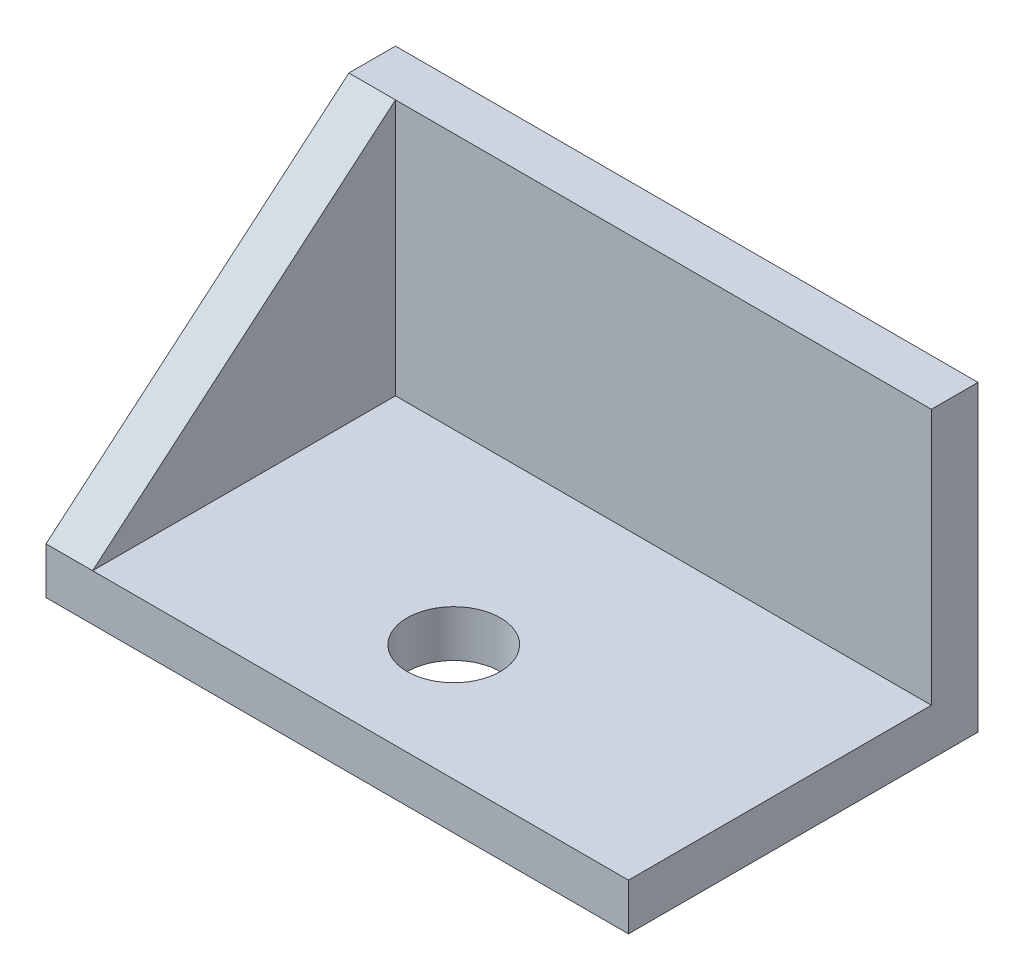
ISO-10303-21;
HEADER;
FILE_DESCRIPTION(('STEP AP214'),'2;1');
FILE_NAME('part.step','',(''),(''),'','','');
FILE_SCHEMA(('AUTOMOTIVE_DESIGN { 1 0 10303 214 1 1 1 1 }'));
ENDSEC;
DATA;
#1=APPLICATION_CONTEXT('core data for automotive mechanical design processes');
#2=APPLICATION_PROTOCOL_DEFINITION('international standard','automotive_design',2000,#1);
#3=PRODUCT_CONTEXT('',#1,'mechanical');
#4=PRODUCT('Part','Part','',(#3));
#5=PRODUCT_RELATED_PRODUCT_CATEGORY('part','',(#4));
#6=PRODUCT_DEFINITION_FORMATION('','',#4);
#7=PRODUCT_DEFINITION_CONTEXT('part definition',#1,'design');
#8=PRODUCT_DEFINITION('design','',#6,#7);
#9=PRODUCT_DEFINITION_SHAPE('','',#8);
#10=(LENGTH_UNIT() NAMED_UNIT(*) SI_UNIT(.MILLI.,.METRE.));
#11=(NAMED_UNIT(*) PLANE_ANGLE_UNIT() SI_UNIT($,.RADIAN.));
#12=(NAMED_UNIT(*) SI_UNIT($,.STERADIAN.) SOLID_ANGLE_UNIT());
#13=UNCERTAINTY_MEASURE_WITH_UNIT(LENGTH_MEASURE(1.E-05),#10,'distance_accuracy_value','');
#14=(GEOMETRIC_REPRESENTATION_CONTEXT(3) GLOBAL_UNCERTAINTY_ASSIGNED_CONTEXT((#13)) GLOBAL_UNIT_ASSIGNED_CONTEXT((#10,
#11,#12)) REPRESENTATION_CONTEXT('',''));
#15=CARTESIAN_POINT('',(0.,0.,0.));
#16=DIRECTION('',(0.,0.,1.));
#17=DIRECTION('',(1.,0.,0.));
#18=AXIS2_PLACEMENT_3D('',#15,#16,#17);
#19=CARTESIAN_POINT('',(0.,5.,0.));
#20=DIRECTION('',(0.,1.,0.));
#21=DIRECTION('',(0.,0.,1.));
#22=AXIS2_PLACEMENT_3D('',#19,#20,#21);
#23=PLANE('',#22);
#24=DIRECTION('',(0.,0.,-1.));
#25=VECTOR('',#24,1.);
#26=CARTESIAN_POINT('',(10.,5.,75.));
#27=LINE('',#26,#25);
#28=CARTESIAN_POINT('',(10.,5.,75.));
#29=VERTEX_POINT('',#28);
#30=CARTESIAN_POINT('',(10.,5.,10.));
#31=VERTEX_POINT('',#30);
#32=EDGE_CURVE('E58',#29,#31,#27,.T.);
#33=ORIENTED_EDGE('',*,*,#32,.F.);
#34=DIRECTION('',(1.,0.,0.));
#35=VECTOR('',#34,1.);
#36=CARTESIAN_POINT('',(0.,5.,75.));
#37=LINE('',#36,#35);
#38=CARTESIAN_POINT('',(125.,5.,75.));
#39=VERTEX_POINT('',#38);
#40=EDGE_CURVE('E150',#29,#39,#37,.T.);
#41=ORIENTED_EDGE('',*,*,#40,.T.);
#42=DIRECTION('',(0.,0.,1.));
#43=VECTOR('',#42,1.);
#44=CARTESIAN_POINT('',(125.,5.,0.));
#45=LINE('',#44,#43);
#46=CARTESIAN_POINT('',(125.,5.,10.));
#47=VERTEX_POINT('',#46);
#48=EDGE_CURVE('E146',#47,#39,#45,.T.);
#49=ORIENTED_EDGE('',*,*,#48,.F.);
#50=DIRECTION('',(-1.,0.,0.));
#51=VECTOR('',#50,1.);
#52=CARTESIAN_POINT('',(0.,5.,10.));
#53=LINE('',#52,#51);
#54=EDGE_CURVE('E113',#47,#31,#53,.T.);
#55=ORIENTED_EDGE('',*,*,#54,.T.);
#56=EDGE_LOOP('',(#33,#41,#49,#55));
#57=FACE_BOUND('',#56,.T.);
#58=CARTESIAN_POINT('',(62.5,5.,50.));
#59=DIRECTION('',(0.,1.,0.));
#60=DIRECTION('',(0.,0.,1.));
#61=AXIS2_PLACEMENT_3D('',#58,#59,#60);
#62=CIRCLE('',#61,9.99999999999999);
#63=CARTESIAN_POINT('',(62.5,5.,60.));
#64=VERTEX_POINT('',#63);
#65=EDGE_CURVE('E143',#64,#64,#62,.T.);
#66=ORIENTED_EDGE('',*,*,#65,.F.);
#67=EDGE_LOOP('',(#66));
#68=FACE_BOUND('',#67,.T.);
#69=ADVANCED_FACE('F43',(#57,#68),#23,.T.);
#70=CARTESIAN_POINT('',(125.,5.,0.));
#71=DIRECTION('',(1.,0.,0.));
#72=DIRECTION('',(0.,0.,-1.));
#73=AXIS2_PLACEMENT_3D('',#70,#71,#72);
#74=PLANE('',#73);
#75=DIRECTION('',(0.,0.,1.));
#76=VECTOR('',#75,1.);
#77=CARTESIAN_POINT('',(125.,-5.,0.));
#78=LINE('',#77,#76);
#79=CARTESIAN_POINT('',(125.,-5.,0.));
#80=VERTEX_POINT('',#79);
#81=CARTESIAN_POINT('',(125.,-5.,75.));
#82=VERTEX_POINT('',#81);
#83=EDGE_CURVE('E156',#80,#82,#78,.T.);
#84=ORIENTED_EDGE('',*,*,#83,.F.);
#85=DIRECTION('',(0.,-1.,0.));
#86=VECTOR('',#85,1.);
#87=CARTESIAN_POINT('',(125.,5.,0.));
#88=LINE('',#87,#86);
#89=CARTESIAN_POINT('',(125.,60.,0.));
#90=VERTEX_POINT('',#89);
#91=EDGE_CURVE('E11',#90,#80,#88,.T.);
#92=ORIENTED_EDGE('',*,*,#91,.F.);
#93=DIRECTION('',(0.,0.,-1.));
#94=VECTOR('',#93,1.);
#95=CARTESIAN_POINT('',(125.,60.,0.));
#96=LINE('',#95,#94);
#97=CARTESIAN_POINT('',(125.,60.,10.));
#98=VERTEX_POINT('',#97);
#99=EDGE_CURVE('E135',#98,#90,#96,.T.);
#100=ORIENTED_EDGE('',*,*,#99,.F.);
#101=DIRECTION('',(0.,-1.,0.));
#102=VECTOR('',#101,1.);
#103=CARTESIAN_POINT('',(125.,60.,10.));
#104=LINE('',#103,#102);
#105=EDGE_CURVE('E139',#98,#47,#104,.T.);
#106=ORIENTED_EDGE('',*,*,#105,.T.);
#107=ORIENTED_EDGE('',*,*,#48,.T.);
#108=DIRECTION('',(0.,-1.,0.));
#109=VECTOR('',#108,1.);
#110=CARTESIAN_POINT('',(125.,5.,75.));
#111=LINE('',#110,#109);
#112=EDGE_CURVE('E153',#39,#82,#111,.T.);
#113=ORIENTED_EDGE('',*,*,#112,.T.);
#114=EDGE_LOOP('',(#84,#92,#100,#106,#107,#113));
#115=FACE_BOUND('',#114,.T.);
#116=ADVANCED_FACE('F176',(#115),#74,.T.);
#117=CARTESIAN_POINT('',(0.,5.,0.));
#118=DIRECTION('',(0.,0.,-1.));
#119=DIRECTION('',(-1.,0.,0.));
#120=AXIS2_PLACEMENT_3D('',#117,#118,#119);
#121=PLANE('',#120);
#122=DIRECTION('',(1.,0.,0.));
#123=VECTOR('',#122,1.);
#124=CARTESIAN_POINT('',(0.,-5.,0.));
#125=LINE('',#124,#123);
#126=CARTESIAN_POINT('',(0.,-5.,0.));
#127=VERTEX_POINT('',#126);
#128=EDGE_CURVE('E159',#127,#80,#125,.T.);
#129=ORIENTED_EDGE('',*,*,#128,.F.);
#130=DIRECTION('',(0.,-1.,0.));
#131=VECTOR('',#130,1.);
#132=CARTESIAN_POINT('',(0.,5.,0.));
#133=LINE('',#132,#131);
#134=CARTESIAN_POINT('',(0.,60.,0.));
#135=VERTEX_POINT('',#134);
#136=EDGE_CURVE('E51',#135,#127,#133,.T.);
#137=ORIENTED_EDGE('',*,*,#136,.F.);
#138=DIRECTION('',(-1.,0.,0.));
#139=VECTOR('',#138,1.);
#140=CARTESIAN_POINT('',(0.,60.,0.));
#141=LINE('',#140,#139);
#142=EDGE_CURVE('E110',#90,#135,#141,.T.);
#143=ORIENTED_EDGE('',*,*,#142,.F.);
#144=ORIENTED_EDGE('',*,*,#91,.T.);
#145=EDGE_LOOP('',(#129,#137,#143,#144));
#146=FACE_BOUND('',#145,.T.);
#147=ADVANCED_FACE('F172',(#146),#121,.T.);
#148=CARTESIAN_POINT('',(0.,5.,0.));
#149=DIRECTION('',(1.,0.,0.));
#150=DIRECTION('',(0.,0.,-1.));
#151=AXIS2_PLACEMENT_3D('',#148,#149,#150);
#152=PLANE('',#151);
#153=DIRECTION('',(0.,-1.,0.));
#154=VECTOR('',#153,1.);
#155=CARTESIAN_POINT('',(0.,5.,75.));
#156=LINE('',#155,#154);
#157=CARTESIAN_POINT('',(0.,5.,75.));
#158=VERTEX_POINT('',#157);
#159=CARTESIAN_POINT('',(0.,-5.,75.));
#160=VERTEX_POINT('',#159);
#161=EDGE_CURVE('E128',#158,#160,#156,.T.);
#162=ORIENTED_EDGE('',*,*,#161,.F.);
#163=DIRECTION('',(0.,-0.645942241466174,0.763386285369114));
#164=VECTOR('',#163,1.);
#165=CARTESIAN_POINT('',(0.,5.,75.));
#166=LINE('',#165,#164);
#167=CARTESIAN_POINT('',(0.,60.,10.));
#168=VERTEX_POINT('',#167);
#169=EDGE_CURVE('E120',#168,#158,#166,.T.);
#170=ORIENTED_EDGE('',*,*,#169,.F.);
#171=DIRECTION('',(0.,0.,-1.));
#172=VECTOR('',#171,1.);
#173=CARTESIAN_POINT('',(0.,60.,0.));
#174=LINE('',#173,#172);
#175=EDGE_CURVE('E103',#168,#135,#174,.T.);
#176=ORIENTED_EDGE('',*,*,#175,.T.);
#177=ORIENTED_EDGE('',*,*,#136,.T.);
#178=DIRECTION('',(0.,0.,1.));
#179=VECTOR('',#178,1.);
#180=CARTESIAN_POINT('',(0.,-5.,0.));
#181=LINE('',#180,#179);
#182=EDGE_CURVE('E162',#127,#160,#181,.T.);
#183=ORIENTED_EDGE('',*,*,#182,.T.);
#184=EDGE_LOOP('',(#162,#170,#176,#177,#183));
#185=FACE_BOUND('',#184,.T.);
#186=ADVANCED_FACE('F125',(#185),#152,.F.);
#187=CARTESIAN_POINT('',(62.5,5.,50.));
#188=DIRECTION('',(0.,-1.,0.));
#189=DIRECTION('',(0.,0.,-1.));
#190=AXIS2_PLACEMENT_3D('',#187,#188,#189);
#191=CYLINDRICAL_SURFACE('',#190,9.99999999999999);
#192=ORIENTED_EDGE('',*,*,#65,.T.);
#193=EDGE_LOOP('',(#192));
#194=FACE_BOUND('',#193,.T.);
#195=CARTESIAN_POINT('',(62.5,-5.,50.));
#196=DIRECTION('',(0.,1.,0.));
#197=DIRECTION('',(0.,0.,1.));
#198=AXIS2_PLACEMENT_3D('',#195,#196,#197);
#199=CIRCLE('',#198,9.99999999999999);
#200=CARTESIAN_POINT('',(62.5,-5.,60.));
#201=VERTEX_POINT('',#200);
#202=EDGE_CURVE('E142',#201,#201,#199,.T.);
#203=ORIENTED_EDGE('',*,*,#202,.F.);
#204=EDGE_LOOP('',(#203));
#205=FACE_BOUND('',#204,.T.);
#206=ADVANCED_FACE('F45',(#194,#205),#191,.F.);
#207=CARTESIAN_POINT('',(0.,5.,75.));
#208=DIRECTION('',(0.,0.,-1.));
#209=DIRECTION('',(-1.,0.,0.));
#210=AXIS2_PLACEMENT_3D('',#207,#208,#209);
#211=PLANE('',#210);
#212=DIRECTION('',(1.,0.,0.));
#213=VECTOR('',#212,1.);
#214=CARTESIAN_POINT('',(0.,-5.,75.));
#215=LINE('',#214,#213);
#216=EDGE_CURVE('E147',#160,#82,#215,.T.);
#217=ORIENTED_EDGE('',*,*,#216,.T.);
#218=ORIENTED_EDGE('',*,*,#112,.F.);
#219=ORIENTED_EDGE('',*,*,#40,.F.);
#220=EDGE_CURVE('E151',#158,#29,#37,.T.);
#221=ORIENTED_EDGE('',*,*,#220,.F.);
#222=ORIENTED_EDGE('',*,*,#161,.T.);
#223=EDGE_LOOP('',(#217,#218,#219,#221,#222));
#224=FACE_BOUND('',#223,.T.);
#225=ADVANCED_FACE('F180',(#224),#211,.F.);
#226=CARTESIAN_POINT('',(0.,-5.,0.));
#227=DIRECTION('',(0.,1.,0.));
#228=DIRECTION('',(0.,0.,1.));
#229=AXIS2_PLACEMENT_3D('',#226,#227,#228);
#230=PLANE('',#229);
#231=ORIENTED_EDGE('',*,*,#202,.T.);
#232=EDGE_LOOP('',(#231));
#233=FACE_BOUND('',#232,.T.);
#234=ORIENTED_EDGE('',*,*,#83,.T.);
#235=ORIENTED_EDGE('',*,*,#216,.F.);
#236=ORIENTED_EDGE('',*,*,#182,.F.);
#237=ORIENTED_EDGE('',*,*,#128,.T.);
#238=EDGE_LOOP('',(#234,#235,#236,#237));
#239=FACE_BOUND('',#238,.T.);
#240=ADVANCED_FACE('F171',(#233,#239),#230,.F.);
#241=CARTESIAN_POINT('',(0.,60.,10.));
#242=DIRECTION('',(0.,0.,1.));
#243=DIRECTION('',(1.,0.,0.));
#244=AXIS2_PLACEMENT_3D('',#241,#242,#243);
#245=PLANE('',#244);
#246=DIRECTION('',(0.,1.,0.));
#247=VECTOR('',#246,1.);
#248=CARTESIAN_POINT('',(10.,5.,10.));
#249=LINE('',#248,#247);
#250=CARTESIAN_POINT('',(10.,60.,10.));
#251=VERTEX_POINT('',#250);
#252=EDGE_CURVE('E66',#31,#251,#249,.T.);
#253=ORIENTED_EDGE('',*,*,#252,.F.);
#254=ORIENTED_EDGE('',*,*,#54,.F.);
#255=ORIENTED_EDGE('',*,*,#105,.F.);
#256=DIRECTION('',(-1.,0.,0.));
#257=VECTOR('',#256,1.);
#258=CARTESIAN_POINT('',(0.,60.,10.));
#259=LINE('',#258,#257);
#260=EDGE_CURVE('E137',#98,#251,#259,.T.);
#261=ORIENTED_EDGE('',*,*,#260,.T.);
#262=EDGE_LOOP('',(#253,#254,#255,#261));
#263=FACE_BOUND('',#262,.T.);
#264=ADVANCED_FACE('F199',(#263),#245,.T.);
#265=CARTESIAN_POINT('',(0.,60.,0.));
#266=DIRECTION('',(0.,1.,0.));
#267=DIRECTION('',(0.,0.,1.));
#268=AXIS2_PLACEMENT_3D('',#265,#266,#267);
#269=PLANE('',#268);
#270=ORIENTED_EDGE('',*,*,#175,.F.);
#271=DIRECTION('',(-1.,0.,0.));
#272=VECTOR('',#271,1.);
#273=CARTESIAN_POINT('',(10.,60.,10.));
#274=LINE('',#273,#272);
#275=EDGE_CURVE('E107',#251,#168,#274,.T.);
#276=ORIENTED_EDGE('',*,*,#275,.F.);
#277=ORIENTED_EDGE('',*,*,#260,.F.);
#278=ORIENTED_EDGE('',*,*,#99,.T.);
#279=ORIENTED_EDGE('',*,*,#142,.T.);
#280=EDGE_LOOP('',(#270,#276,#277,#278,#279));
#281=FACE_BOUND('',#280,.T.);
#282=ADVANCED_FACE('F105',(#281),#269,.T.);
#283=CARTESIAN_POINT('',(10.,5.,75.));
#284=DIRECTION('',(0.,-0.763386285369115,-0.645942241466174));
#285=DIRECTION('',(0.,0.645942241466174,-0.763386285369115));
#286=AXIS2_PLACEMENT_3D('',#283,#284,#285);
#287=PLANE('',#286);
#288=ORIENTED_EDGE('',*,*,#169,.T.);
#289=ORIENTED_EDGE('',*,*,#220,.T.);
#290=DIRECTION('',(0.,-0.645942241466174,0.763386285369114));
#291=VECTOR('',#290,1.);
#292=CARTESIAN_POINT('',(10.,5.,75.));
#293=LINE('',#292,#291);
#294=EDGE_CURVE('E122',#251,#29,#293,.T.);
#295=ORIENTED_EDGE('',*,*,#294,.F.);
#296=ORIENTED_EDGE('',*,*,#275,.T.);
#297=EDGE_LOOP('',(#288,#289,#295,#296));
#298=FACE_BOUND('',#297,.T.);
#299=ADVANCED_FACE('F118',(#298),#287,.F.);
#300=CARTESIAN_POINT('',(10.,0.,0.));
#301=DIRECTION('',(1.,0.,0.));
#302=DIRECTION('',(0.,0.,-1.));
#303=AXIS2_PLACEMENT_3D('',#300,#301,#302);
#304=PLANE('',#303);
#305=ORIENTED_EDGE('',*,*,#32,.T.);
#306=ORIENTED_EDGE('',*,*,#252,.T.);
#307=ORIENTED_EDGE('',*,*,#294,.T.);
#308=EDGE_LOOP('',(#305,#306,#307));
#309=FACE_BOUND('',#308,.T.);
#310=ADVANCED_FACE('F182',(#309),#304,.T.);
#311=CLOSED_SHELL('',(#69,#116,#147,#186,#206,#225,#240,#264,#282,#299,#310));
#312=MANIFOLD_SOLID_BREP('B2',#311);
#313=ADVANCED_BREP_SHAPE_REPRESENTATION('',(#18,#312),#14);
#314=SHAPE_DEFINITION_REPRESENTATION(#9,#313);
ENDSEC;
END-ISO-10303-21;
